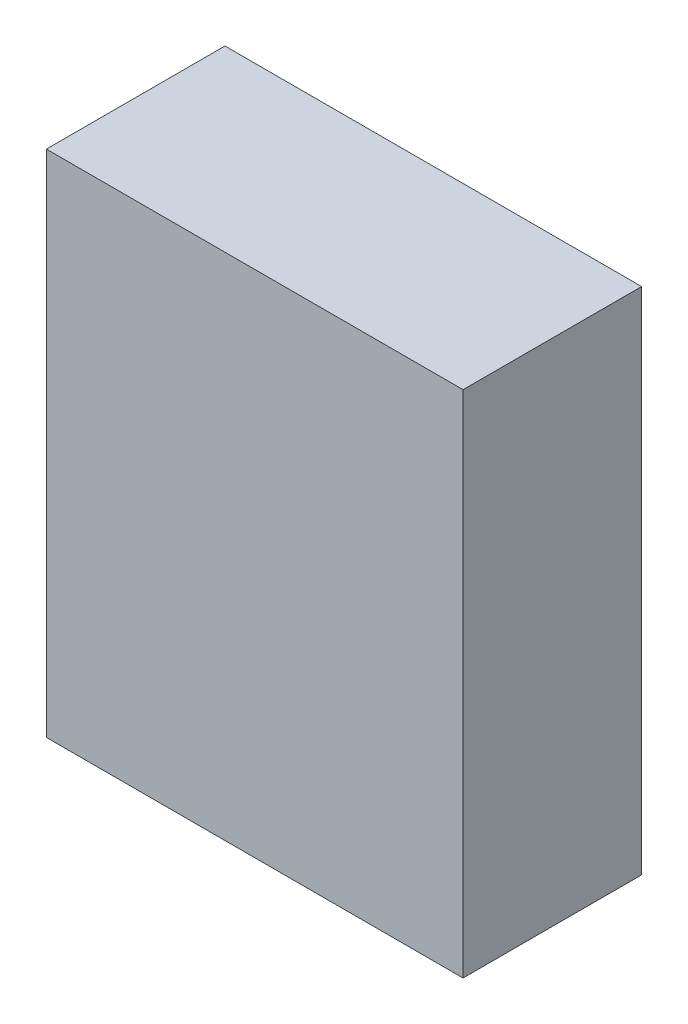
ISO-10303-21;
HEADER;
FILE_DESCRIPTION(('STEP AP214'),'2;1');
FILE_NAME('part.step','',(''),(''),'','','');
FILE_SCHEMA(('AUTOMOTIVE_DESIGN { 1 0 10303 214 1 1 1 1 }'));
ENDSEC;
DATA;
#1=APPLICATION_CONTEXT('core data for automotive mechanical design processes');
#2=APPLICATION_PROTOCOL_DEFINITION('international standard','automotive_design',2000,#1);
#3=PRODUCT_CONTEXT('',#1,'mechanical');
#4=PRODUCT('Part','Part','',(#3));
#5=PRODUCT_RELATED_PRODUCT_CATEGORY('part','',(#4));
#6=PRODUCT_DEFINITION_FORMATION('','',#4);
#7=PRODUCT_DEFINITION_CONTEXT('part definition',#1,'design');
#8=PRODUCT_DEFINITION('design','',#6,#7);
#9=PRODUCT_DEFINITION_SHAPE('','',#8);
#10=(LENGTH_UNIT() NAMED_UNIT(*) SI_UNIT(.MILLI.,.METRE.));
#11=(NAMED_UNIT(*) PLANE_ANGLE_UNIT() SI_UNIT($,.RADIAN.));
#12=(NAMED_UNIT(*) SI_UNIT($,.STERADIAN.) SOLID_ANGLE_UNIT());
#13=UNCERTAINTY_MEASURE_WITH_UNIT(LENGTH_MEASURE(1.E-05),#10,'distance_accuracy_value','');
#14=(GEOMETRIC_REPRESENTATION_CONTEXT(3) GLOBAL_UNCERTAINTY_ASSIGNED_CONTEXT((#13)) GLOBAL_UNIT_ASSIGNED_CONTEXT((#10,
#11,#12)) REPRESENTATION_CONTEXT('',''));
#15=CARTESIAN_POINT('',(0.,0.,0.));
#16=DIRECTION('',(0.,0.,1.));
#17=DIRECTION('',(1.,0.,0.));
#18=AXIS2_PLACEMENT_3D('',#15,#16,#17);
#19=CARTESIAN_POINT('',(0.,108.712,0.));
#20=DIRECTION('',(1.,0.,0.));
#21=DIRECTION('',(0.,0.,-1.));
#22=AXIS2_PLACEMENT_3D('',#19,#20,#21);
#23=PLANE('',#22);
#24=DIRECTION('',(0.,0.,1.));
#25=VECTOR('',#24,1.);
#26=CARTESIAN_POINT('',(0.,0.,0.));
#27=LINE('',#26,#25);
#28=CARTESIAN_POINT('',(0.,0.,-38.1));
#29=VERTEX_POINT('',#28);
#30=CARTESIAN_POINT('',(0.,0.,0.));
#31=VERTEX_POINT('',#30);
#32=EDGE_CURVE('E100',#29,#31,#27,.T.);
#33=ORIENTED_EDGE('',*,*,#32,.T.);
#34=DIRECTION('',(0.,-1.,0.));
#35=VECTOR('',#34,1.);
#36=CARTESIAN_POINT('',(0.,108.712,0.));
#37=LINE('',#36,#35);
#38=CARTESIAN_POINT('',(0.,108.712,0.));
#39=VERTEX_POINT('',#38);
#40=EDGE_CURVE('E11',#39,#31,#37,.T.);
#41=ORIENTED_EDGE('',*,*,#40,.F.);
#42=DIRECTION('',(0.,0.,1.));
#43=VECTOR('',#42,1.);
#44=CARTESIAN_POINT('',(0.,108.712,0.));
#45=LINE('',#44,#43);
#46=CARTESIAN_POINT('',(0.,108.712,-38.1));
#47=VERTEX_POINT('',#46);
#48=EDGE_CURVE('E88',#47,#39,#45,.T.);
#49=ORIENTED_EDGE('',*,*,#48,.F.);
#50=DIRECTION('',(0.,-1.,0.));
#51=VECTOR('',#50,1.);
#52=CARTESIAN_POINT('',(0.,108.712,-38.1));
#53=LINE('',#52,#51);
#54=EDGE_CURVE('E96',#47,#29,#53,.T.);
#55=ORIENTED_EDGE('',*,*,#54,.T.);
#56=EDGE_LOOP('',(#33,#41,#49,#55));
#57=FACE_BOUND('',#56,.T.);
#58=ADVANCED_FACE('F37',(#57),#23,.F.);
#59=CARTESIAN_POINT('',(0.,108.712,0.));
#60=DIRECTION('',(0.,0.,-1.));
#61=DIRECTION('',(-1.,0.,0.));
#62=AXIS2_PLACEMENT_3D('',#59,#60,#61);
#63=PLANE('',#62);
#64=DIRECTION('',(1.,0.,0.));
#65=VECTOR('',#64,1.);
#66=CARTESIAN_POINT('',(0.,0.,0.));
#67=LINE('',#66,#65);
#68=CARTESIAN_POINT('',(88.9,0.,0.));
#69=VERTEX_POINT('',#68);
#70=EDGE_CURVE('E92',#31,#69,#67,.T.);
#71=ORIENTED_EDGE('',*,*,#70,.T.);
#72=DIRECTION('',(0.,-1.,0.));
#73=VECTOR('',#72,1.);
#74=CARTESIAN_POINT('',(88.9,108.712,0.));
#75=LINE('',#74,#73);
#76=CARTESIAN_POINT('',(88.9,108.712,0.));
#77=VERTEX_POINT('',#76);
#78=EDGE_CURVE('E45',#77,#69,#75,.T.);
#79=ORIENTED_EDGE('',*,*,#78,.F.);
#80=DIRECTION('',(1.,0.,0.));
#81=VECTOR('',#80,1.);
#82=CARTESIAN_POINT('',(0.,108.712,0.));
#83=LINE('',#82,#81);
#84=EDGE_CURVE('E83',#39,#77,#83,.T.);
#85=ORIENTED_EDGE('',*,*,#84,.F.);
#86=ORIENTED_EDGE('',*,*,#40,.T.);
#87=EDGE_LOOP('',(#71,#79,#85,#86));
#88=FACE_BOUND('',#87,.T.);
#89=ADVANCED_FACE('F91',(#88),#63,.F.);
#90=CARTESIAN_POINT('',(88.9,108.712,0.));
#91=DIRECTION('',(-1.,0.,0.));
#92=DIRECTION('',(0.,0.,1.));
#93=AXIS2_PLACEMENT_3D('',#90,#91,#92);
#94=PLANE('',#93);
#95=DIRECTION('',(0.,0.,-1.));
#96=VECTOR('',#95,1.);
#97=CARTESIAN_POINT('',(88.9,0.,0.));
#98=LINE('',#97,#96);
#99=CARTESIAN_POINT('',(88.9,0.,-38.1));
#100=VERTEX_POINT('',#99);
#101=EDGE_CURVE('E70',#69,#100,#98,.T.);
#102=ORIENTED_EDGE('',*,*,#101,.T.);
#103=DIRECTION('',(0.,-1.,0.));
#104=VECTOR('',#103,1.);
#105=CARTESIAN_POINT('',(88.9,108.712,-38.1));
#106=LINE('',#105,#104);
#107=CARTESIAN_POINT('',(88.9,108.712,-38.1));
#108=VERTEX_POINT('',#107);
#109=EDGE_CURVE('E93',#108,#100,#106,.T.);
#110=ORIENTED_EDGE('',*,*,#109,.F.);
#111=DIRECTION('',(0.,0.,-1.));
#112=VECTOR('',#111,1.);
#113=CARTESIAN_POINT('',(88.9,108.712,0.));
#114=LINE('',#113,#112);
#115=EDGE_CURVE('E86',#77,#108,#114,.T.);
#116=ORIENTED_EDGE('',*,*,#115,.F.);
#117=ORIENTED_EDGE('',*,*,#78,.T.);
#118=EDGE_LOOP('',(#102,#110,#116,#117));
#119=FACE_BOUND('',#118,.T.);
#120=ADVANCED_FACE('F94',(#119),#94,.F.);
#121=CARTESIAN_POINT('',(0.,108.712,-38.1));
#122=DIRECTION('',(0.,0.,1.));
#123=DIRECTION('',(1.,0.,0.));
#124=AXIS2_PLACEMENT_3D('',#121,#122,#123);
#125=PLANE('',#124);
#126=DIRECTION('',(-1.,0.,0.));
#127=VECTOR('',#126,1.);
#128=CARTESIAN_POINT('',(0.,0.,-38.1));
#129=LINE('',#128,#127);
#130=EDGE_CURVE('E76',#100,#29,#129,.T.);
#131=ORIENTED_EDGE('',*,*,#130,.T.);
#132=ORIENTED_EDGE('',*,*,#54,.F.);
#133=DIRECTION('',(-1.,0.,0.));
#134=VECTOR('',#133,1.);
#135=CARTESIAN_POINT('',(0.,108.712,-38.1));
#136=LINE('',#135,#134);
#137=EDGE_CURVE('E53',#108,#47,#136,.T.);
#138=ORIENTED_EDGE('',*,*,#137,.F.);
#139=ORIENTED_EDGE('',*,*,#109,.T.);
#140=EDGE_LOOP('',(#131,#132,#138,#139));
#141=FACE_BOUND('',#140,.T.);
#142=ADVANCED_FACE('F107',(#141),#125,.F.);
#143=CARTESIAN_POINT('',(0.,108.712,0.));
#144=DIRECTION('',(0.,-1.,0.));
#145=DIRECTION('',(0.,0.,-1.));
#146=AXIS2_PLACEMENT_3D('',#143,#144,#145);
#147=PLANE('',#146);
#148=ORIENTED_EDGE('',*,*,#48,.T.);
#149=ORIENTED_EDGE('',*,*,#84,.T.);
#150=ORIENTED_EDGE('',*,*,#115,.T.);
#151=ORIENTED_EDGE('',*,*,#137,.T.);
#152=EDGE_LOOP('',(#148,#149,#150,#151));
#153=FACE_BOUND('',#152,.T.);
#154=ADVANCED_FACE('F84',(#153),#147,.F.);
#155=CARTESIAN_POINT('',(0.,0.,0.));
#156=DIRECTION('',(0.,-1.,0.));
#157=DIRECTION('',(0.,0.,-1.));
#158=AXIS2_PLACEMENT_3D('',#155,#156,#157);
#159=PLANE('',#158);
#160=ORIENTED_EDGE('',*,*,#32,.F.);
#161=ORIENTED_EDGE('',*,*,#130,.F.);
#162=ORIENTED_EDGE('',*,*,#101,.F.);
#163=ORIENTED_EDGE('',*,*,#70,.F.);
#164=EDGE_LOOP('',(#160,#161,#162,#163));
#165=FACE_BOUND('',#164,.T.);
#166=ADVANCED_FACE('F110',(#165),#159,.T.);
#167=CLOSED_SHELL('',(#58,#89,#120,#142,#154,#166));
#168=MANIFOLD_SOLID_BREP('B2',#167);
#169=ADVANCED_BREP_SHAPE_REPRESENTATION('',(#18,#168),#14);
#170=SHAPE_DEFINITION_REPRESENTATION(#9,#169);
ENDSEC;
END-ISO-10303-21;
